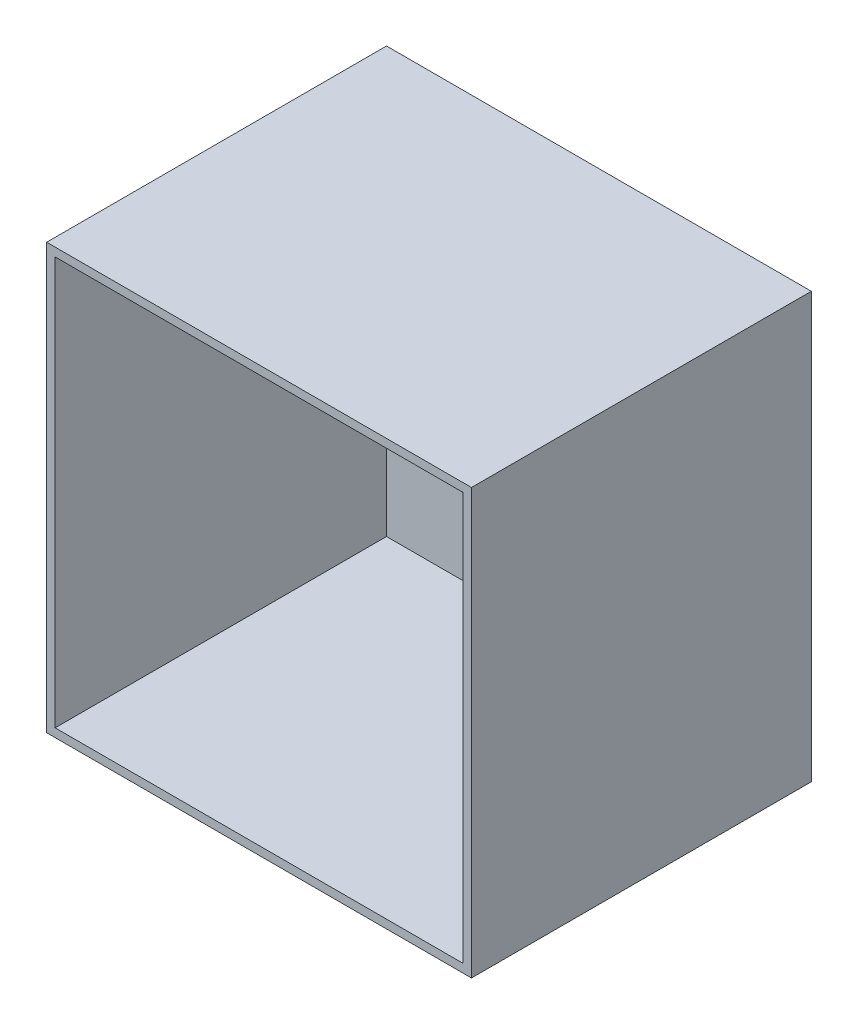
ISO-10303-21;
HEADER;
FILE_DESCRIPTION(('STEP AP214'),'2;1');
FILE_NAME('part.step','',(''),(''),'','','');
FILE_SCHEMA(('AUTOMOTIVE_DESIGN { 1 0 10303 214 1 1 1 1 }'));
ENDSEC;
DATA;
#1=APPLICATION_CONTEXT('core data for automotive mechanical design processes');
#2=APPLICATION_PROTOCOL_DEFINITION('international standard','automotive_design',2000,#1);
#3=PRODUCT_CONTEXT('',#1,'mechanical');
#4=PRODUCT('Part','Part','',(#3));
#5=PRODUCT_RELATED_PRODUCT_CATEGORY('part','',(#4));
#6=PRODUCT_DEFINITION_FORMATION('','',#4);
#7=PRODUCT_DEFINITION_CONTEXT('part definition',#1,'design');
#8=PRODUCT_DEFINITION('design','',#6,#7);
#9=PRODUCT_DEFINITION_SHAPE('','',#8);
#10=(LENGTH_UNIT() NAMED_UNIT(*) SI_UNIT(.MILLI.,.METRE.));
#11=(NAMED_UNIT(*) PLANE_ANGLE_UNIT() SI_UNIT($,.RADIAN.));
#12=(NAMED_UNIT(*) SI_UNIT($,.STERADIAN.) SOLID_ANGLE_UNIT());
#13=UNCERTAINTY_MEASURE_WITH_UNIT(LENGTH_MEASURE(1.E-05),#10,'distance_accuracy_value','');
#14=(GEOMETRIC_REPRESENTATION_CONTEXT(3) GLOBAL_UNCERTAINTY_ASSIGNED_CONTEXT((#13)) GLOBAL_UNIT_ASSIGNED_CONTEXT((#10,
#11,#12)) REPRESENTATION_CONTEXT('',''));
#15=CARTESIAN_POINT('',(0.,0.,0.));
#16=DIRECTION('',(0.,0.,1.));
#17=DIRECTION('',(1.,0.,0.));
#18=AXIS2_PLACEMENT_3D('',#15,#16,#17);
#19=CARTESIAN_POINT('',(0.,0.,120.));
#20=DIRECTION('',(1.,0.,0.));
#21=DIRECTION('',(0.,1.,0.));
#22=AXIS2_PLACEMENT_3D('',#19,#20,#21);
#23=PLANE('',#22);
#24=DIRECTION('',(0.,-1.,0.));
#25=VECTOR('',#24,1.);
#26=CARTESIAN_POINT('',(0.,0.,0.));
#27=LINE('',#26,#25);
#28=CARTESIAN_POINT('',(0.,0.,0.));
#29=VERTEX_POINT('',#28);
#30=CARTESIAN_POINT('',(0.,-150.,0.));
#31=VERTEX_POINT('',#30);
#32=EDGE_CURVE('E149',#29,#31,#27,.T.);
#33=ORIENTED_EDGE('',*,*,#32,.T.);
#34=DIRECTION('',(0.,0.,-1.));
#35=VECTOR('',#34,1.);
#36=CARTESIAN_POINT('',(0.,-150.,120.));
#37=LINE('',#36,#35);
#38=CARTESIAN_POINT('',(0.,-150.,120.));
#39=VERTEX_POINT('',#38);
#40=EDGE_CURVE('E11',#39,#31,#37,.T.);
#41=ORIENTED_EDGE('',*,*,#40,.F.);
#42=DIRECTION('',(0.,-1.,0.));
#43=VECTOR('',#42,1.);
#44=CARTESIAN_POINT('',(0.,0.,120.));
#45=LINE('',#44,#43);
#46=CARTESIAN_POINT('',(0.,0.,120.));
#47=VERTEX_POINT('',#46);
#48=EDGE_CURVE('E142',#47,#39,#45,.T.);
#49=ORIENTED_EDGE('',*,*,#48,.F.);
#50=DIRECTION('',(0.,0.,-1.));
#51=VECTOR('',#50,1.);
#52=CARTESIAN_POINT('',(0.,0.,120.));
#53=LINE('',#52,#51);
#54=EDGE_CURVE('E148',#47,#29,#53,.T.);
#55=ORIENTED_EDGE('',*,*,#54,.T.);
#56=EDGE_LOOP('',(#33,#41,#49,#55));
#57=FACE_BOUND('',#56,.T.);
#58=ADVANCED_FACE('F35',(#57),#23,.F.);
#59=CARTESIAN_POINT('',(0.,-150.,120.));
#60=DIRECTION('',(0.,1.,0.));
#61=DIRECTION('',(0.,0.,1.));
#62=AXIS2_PLACEMENT_3D('',#59,#60,#61);
#63=PLANE('',#62);
#64=DIRECTION('',(1.,0.,0.));
#65=VECTOR('',#64,1.);
#66=CARTESIAN_POINT('',(0.,-150.,0.));
#67=LINE('',#66,#65);
#68=CARTESIAN_POINT('',(150.,-150.,0.));
#69=VERTEX_POINT('',#68);
#70=EDGE_CURVE('E152',#31,#69,#67,.T.);
#71=ORIENTED_EDGE('',*,*,#70,.T.);
#72=DIRECTION('',(0.,0.,-1.));
#73=VECTOR('',#72,1.);
#74=CARTESIAN_POINT('',(150.,-150.,120.));
#75=LINE('',#74,#73);
#76=CARTESIAN_POINT('',(150.,-150.,120.));
#77=VERTEX_POINT('',#76);
#78=EDGE_CURVE('E42',#77,#69,#75,.T.);
#79=ORIENTED_EDGE('',*,*,#78,.F.);
#80=DIRECTION('',(1.,0.,0.));
#81=VECTOR('',#80,1.);
#82=CARTESIAN_POINT('',(0.,-150.,120.));
#83=LINE('',#82,#81);
#84=EDGE_CURVE('E86',#39,#77,#83,.T.);
#85=ORIENTED_EDGE('',*,*,#84,.F.);
#86=ORIENTED_EDGE('',*,*,#40,.T.);
#87=EDGE_LOOP('',(#71,#79,#85,#86));
#88=FACE_BOUND('',#87,.T.);
#89=ADVANCED_FACE('F181',(#88),#63,.F.);
#90=CARTESIAN_POINT('',(150.,0.,120.));
#91=DIRECTION('',(-1.,0.,0.));
#92=DIRECTION('',(0.,-1.,0.));
#93=AXIS2_PLACEMENT_3D('',#90,#91,#92);
#94=PLANE('',#93);
#95=DIRECTION('',(0.,1.,0.));
#96=VECTOR('',#95,1.);
#97=CARTESIAN_POINT('',(150.,0.,0.));
#98=LINE('',#97,#96);
#99=CARTESIAN_POINT('',(150.,0.,0.));
#100=VERTEX_POINT('',#99);
#101=EDGE_CURVE('E154',#69,#100,#98,.T.);
#102=ORIENTED_EDGE('',*,*,#101,.T.);
#103=DIRECTION('',(0.,0.,-1.));
#104=VECTOR('',#103,1.);
#105=CARTESIAN_POINT('',(150.,0.,120.));
#106=LINE('',#105,#104);
#107=CARTESIAN_POINT('',(150.,0.,120.));
#108=VERTEX_POINT('',#107);
#109=EDGE_CURVE('E158',#108,#100,#106,.T.);
#110=ORIENTED_EDGE('',*,*,#109,.F.);
#111=DIRECTION('',(0.,1.,0.));
#112=VECTOR('',#111,1.);
#113=CARTESIAN_POINT('',(150.,0.,120.));
#114=LINE('',#113,#112);
#115=EDGE_CURVE('E145',#77,#108,#114,.T.);
#116=ORIENTED_EDGE('',*,*,#115,.F.);
#117=ORIENTED_EDGE('',*,*,#78,.T.);
#118=EDGE_LOOP('',(#102,#110,#116,#117));
#119=FACE_BOUND('',#118,.T.);
#120=ADVANCED_FACE('F163',(#119),#94,.F.);
#121=CARTESIAN_POINT('',(0.,0.,120.));
#122=DIRECTION('',(0.,-1.,0.));
#123=DIRECTION('',(0.,0.,-1.));
#124=AXIS2_PLACEMENT_3D('',#121,#122,#123);
#125=PLANE('',#124);
#126=DIRECTION('',(-1.,0.,0.));
#127=VECTOR('',#126,1.);
#128=CARTESIAN_POINT('',(0.,0.,0.));
#129=LINE('',#128,#127);
#130=EDGE_CURVE('E79',#100,#29,#129,.T.);
#131=ORIENTED_EDGE('',*,*,#130,.T.);
#132=ORIENTED_EDGE('',*,*,#54,.F.);
#133=DIRECTION('',(-1.,0.,0.));
#134=VECTOR('',#133,1.);
#135=CARTESIAN_POINT('',(0.,0.,120.));
#136=LINE('',#135,#134);
#137=EDGE_CURVE('E58',#108,#47,#136,.T.);
#138=ORIENTED_EDGE('',*,*,#137,.F.);
#139=ORIENTED_EDGE('',*,*,#109,.T.);
#140=EDGE_LOOP('',(#131,#132,#138,#139));
#141=FACE_BOUND('',#140,.T.);
#142=ADVANCED_FACE('F171',(#141),#125,.F.);
#143=CARTESIAN_POINT('',(0.,0.,120.));
#144=DIRECTION('',(0.,0.,1.));
#145=DIRECTION('',(1.,0.,0.));
#146=AXIS2_PLACEMENT_3D('',#143,#144,#145);
#147=PLANE('',#146);
#148=DIRECTION('',(0.,-1.,0.));
#149=VECTOR('',#148,1.);
#150=CARTESIAN_POINT('',(3.,0.,120.));
#151=LINE('',#150,#149);
#152=CARTESIAN_POINT('',(3.,-3.,120.));
#153=VERTEX_POINT('',#152);
#154=CARTESIAN_POINT('',(3.00000000000002,-147.,120.));
#155=VERTEX_POINT('',#154);
#156=EDGE_CURVE('E131',#153,#155,#151,.T.);
#157=ORIENTED_EDGE('',*,*,#156,.F.);
#158=DIRECTION('',(-1.,0.,0.));
#159=VECTOR('',#158,1.);
#160=CARTESIAN_POINT('',(0.,-3.,120.));
#161=LINE('',#160,#159);
#162=CARTESIAN_POINT('',(147.,-3.,120.));
#163=VERTEX_POINT('',#162);
#164=EDGE_CURVE('E140',#163,#153,#161,.T.);
#165=ORIENTED_EDGE('',*,*,#164,.F.);
#166=DIRECTION('',(0.,1.,0.));
#167=VECTOR('',#166,1.);
#168=CARTESIAN_POINT('',(147.,0.,120.));
#169=LINE('',#168,#167);
#170=CARTESIAN_POINT('',(147.,-147.,120.));
#171=VERTEX_POINT('',#170);
#172=EDGE_CURVE('E138',#171,#163,#169,.T.);
#173=ORIENTED_EDGE('',*,*,#172,.F.);
#174=DIRECTION('',(1.,0.,0.));
#175=VECTOR('',#174,1.);
#176=CARTESIAN_POINT('',(0.,-147.,120.));
#177=LINE('',#176,#175);
#178=EDGE_CURVE('E123',#155,#171,#177,.T.);
#179=ORIENTED_EDGE('',*,*,#178,.F.);
#180=EDGE_LOOP('',(#157,#165,#173,#179));
#181=FACE_BOUND('',#180,.T.);
#182=ORIENTED_EDGE('',*,*,#48,.T.);
#183=ORIENTED_EDGE('',*,*,#84,.T.);
#184=ORIENTED_EDGE('',*,*,#115,.T.);
#185=ORIENTED_EDGE('',*,*,#137,.T.);
#186=EDGE_LOOP('',(#182,#183,#184,#185));
#187=FACE_BOUND('',#186,.T.);
#188=ADVANCED_FACE('F173',(#181,#187),#147,.T.);
#189=CARTESIAN_POINT('',(0.,0.,0.));
#190=DIRECTION('',(0.,0.,1.));
#191=DIRECTION('',(1.,0.,0.));
#192=AXIS2_PLACEMENT_3D('',#189,#190,#191);
#193=PLANE('',#192);
#194=ORIENTED_EDGE('',*,*,#32,.F.);
#195=ORIENTED_EDGE('',*,*,#130,.F.);
#196=ORIENTED_EDGE('',*,*,#101,.F.);
#197=ORIENTED_EDGE('',*,*,#70,.F.);
#198=EDGE_LOOP('',(#194,#195,#196,#197));
#199=FACE_BOUND('',#198,.T.);
#200=ADVANCED_FACE('F167',(#199),#193,.F.);
#201=CARTESIAN_POINT('',(3.,0.,120.));
#202=DIRECTION('',(1.,0.,0.));
#203=DIRECTION('',(0.,1.,0.));
#204=AXIS2_PLACEMENT_3D('',#201,#202,#203);
#205=PLANE('',#204);
#206=DIRECTION('',(0.,-1.,0.));
#207=VECTOR('',#206,1.);
#208=CARTESIAN_POINT('',(3.,0.,3.));
#209=LINE('',#208,#207);
#210=CARTESIAN_POINT('',(3.,-3.,3.));
#211=VERTEX_POINT('',#210);
#212=CARTESIAN_POINT('',(3.00000000000002,-147.,3.));
#213=VERTEX_POINT('',#212);
#214=EDGE_CURVE('E114',#211,#213,#209,.T.);
#215=ORIENTED_EDGE('',*,*,#214,.F.);
#216=DIRECTION('',(0.,0.,-1.));
#217=VECTOR('',#216,1.);
#218=CARTESIAN_POINT('',(3.,-3.,120.));
#219=LINE('',#218,#217);
#220=EDGE_CURVE('E134',#153,#211,#219,.T.);
#221=ORIENTED_EDGE('',*,*,#220,.F.);
#222=ORIENTED_EDGE('',*,*,#156,.T.);
#223=DIRECTION('',(0.,0.,-1.));
#224=VECTOR('',#223,1.);
#225=CARTESIAN_POINT('',(3.00000000000002,-147.,120.));
#226=LINE('',#225,#224);
#227=EDGE_CURVE('E126',#155,#213,#226,.T.);
#228=ORIENTED_EDGE('',*,*,#227,.T.);
#229=EDGE_LOOP('',(#215,#221,#222,#228));
#230=FACE_BOUND('',#229,.T.);
#231=ADVANCED_FACE('F208',(#230),#205,.T.);
#232=CARTESIAN_POINT('',(0.,-147.,120.));
#233=DIRECTION('',(0.,1.,0.));
#234=DIRECTION('',(0.,0.,1.));
#235=AXIS2_PLACEMENT_3D('',#232,#233,#234);
#236=PLANE('',#235);
#237=DIRECTION('',(1.,0.,0.));
#238=VECTOR('',#237,1.);
#239=CARTESIAN_POINT('',(0.,-147.,3.));
#240=LINE('',#239,#238);
#241=CARTESIAN_POINT('',(147.,-147.,3.));
#242=VERTEX_POINT('',#241);
#243=EDGE_CURVE('E108',#213,#242,#240,.T.);
#244=ORIENTED_EDGE('',*,*,#243,.F.);
#245=ORIENTED_EDGE('',*,*,#227,.F.);
#246=ORIENTED_EDGE('',*,*,#178,.T.);
#247=DIRECTION('',(0.,0.,-1.));
#248=VECTOR('',#247,1.);
#249=CARTESIAN_POINT('',(147.,-147.,120.));
#250=LINE('',#249,#248);
#251=EDGE_CURVE('E120',#171,#242,#250,.T.);
#252=ORIENTED_EDGE('',*,*,#251,.T.);
#253=EDGE_LOOP('',(#244,#245,#246,#252));
#254=FACE_BOUND('',#253,.T.);
#255=ADVANCED_FACE('F121',(#254),#236,.T.);
#256=CARTESIAN_POINT('',(147.,0.,120.));
#257=DIRECTION('',(-1.,0.,0.));
#258=DIRECTION('',(0.,-1.,0.));
#259=AXIS2_PLACEMENT_3D('',#256,#257,#258);
#260=PLANE('',#259);
#261=DIRECTION('',(0.,1.,0.));
#262=VECTOR('',#261,1.);
#263=CARTESIAN_POINT('',(147.,0.,3.));
#264=LINE('',#263,#262);
#265=CARTESIAN_POINT('',(147.,-3.,3.));
#266=VERTEX_POINT('',#265);
#267=EDGE_CURVE('E112',#242,#266,#264,.T.);
#268=ORIENTED_EDGE('',*,*,#267,.F.);
#269=ORIENTED_EDGE('',*,*,#251,.F.);
#270=ORIENTED_EDGE('',*,*,#172,.T.);
#271=DIRECTION('',(0.,0.,-1.));
#272=VECTOR('',#271,1.);
#273=CARTESIAN_POINT('',(147.,-3.,120.));
#274=LINE('',#273,#272);
#275=EDGE_CURVE('E49',#163,#266,#274,.T.);
#276=ORIENTED_EDGE('',*,*,#275,.T.);
#277=EDGE_LOOP('',(#268,#269,#270,#276));
#278=FACE_BOUND('',#277,.T.);
#279=ADVANCED_FACE('F128',(#278),#260,.T.);
#280=CARTESIAN_POINT('',(0.,-3.,120.));
#281=DIRECTION('',(0.,-1.,0.));
#282=DIRECTION('',(0.,0.,-1.));
#283=AXIS2_PLACEMENT_3D('',#280,#281,#282);
#284=PLANE('',#283);
#285=DIRECTION('',(-1.,0.,0.));
#286=VECTOR('',#285,1.);
#287=CARTESIAN_POINT('',(0.,-3.,3.));
#288=LINE('',#287,#286);
#289=EDGE_CURVE('E129',#266,#211,#288,.T.);
#290=ORIENTED_EDGE('',*,*,#289,.F.);
#291=ORIENTED_EDGE('',*,*,#275,.F.);
#292=ORIENTED_EDGE('',*,*,#164,.T.);
#293=ORIENTED_EDGE('',*,*,#220,.T.);
#294=EDGE_LOOP('',(#290,#291,#292,#293));
#295=FACE_BOUND('',#294,.T.);
#296=ADVANCED_FACE('F238',(#295),#284,.T.);
#297=CARTESIAN_POINT('',(0.,0.,3.));
#298=DIRECTION('',(0.,0.,1.));
#299=DIRECTION('',(1.,0.,0.));
#300=AXIS2_PLACEMENT_3D('',#297,#298,#299);
#301=PLANE('',#300);
#302=ORIENTED_EDGE('',*,*,#214,.T.);
#303=ORIENTED_EDGE('',*,*,#243,.T.);
#304=ORIENTED_EDGE('',*,*,#267,.T.);
#305=ORIENTED_EDGE('',*,*,#289,.T.);
#306=EDGE_LOOP('',(#302,#303,#304,#305));
#307=FACE_BOUND('',#306,.T.);
#308=ADVANCED_FACE('F110',(#307),#301,.T.);
#309=CLOSED_SHELL('',(#58,#89,#120,#142,#188,#200,#231,#255,#279,#296,#308));
#310=MANIFOLD_SOLID_BREP('B2',#309);
#311=ADVANCED_BREP_SHAPE_REPRESENTATION('',(#18,#310),#14);
#312=SHAPE_DEFINITION_REPRESENTATION(#9,#311);
ENDSEC;
END-ISO-10303-21;
